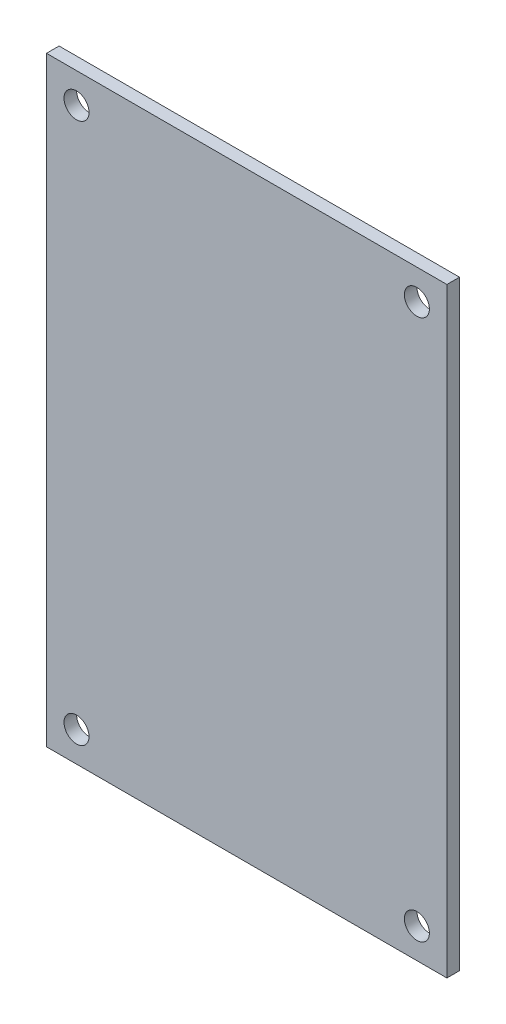
ISO-10303-21;
HEADER;
FILE_DESCRIPTION(('STEP AP214'),'2;1');
FILE_NAME('part.step','',(''),(''),'','','');
FILE_SCHEMA(('AUTOMOTIVE_DESIGN { 1 0 10303 214 1 1 1 1 }'));
ENDSEC;
DATA;
#1=APPLICATION_CONTEXT('core data for automotive mechanical design processes');
#2=APPLICATION_PROTOCOL_DEFINITION('international standard','automotive_design',2000,#1);
#3=PRODUCT_CONTEXT('',#1,'mechanical');
#4=PRODUCT('Part','Part','',(#3));
#5=PRODUCT_RELATED_PRODUCT_CATEGORY('part','',(#4));
#6=PRODUCT_DEFINITION_FORMATION('','',#4);
#7=PRODUCT_DEFINITION_CONTEXT('part definition',#1,'design');
#8=PRODUCT_DEFINITION('design','',#6,#7);
#9=PRODUCT_DEFINITION_SHAPE('','',#8);
#10=(LENGTH_UNIT() NAMED_UNIT(*) SI_UNIT(.MILLI.,.METRE.));
#11=(NAMED_UNIT(*) PLANE_ANGLE_UNIT() SI_UNIT($,.RADIAN.));
#12=(NAMED_UNIT(*) SI_UNIT($,.STERADIAN.) SOLID_ANGLE_UNIT());
#13=UNCERTAINTY_MEASURE_WITH_UNIT(LENGTH_MEASURE(1.E-05),#10,'distance_accuracy_value','');
#14=(GEOMETRIC_REPRESENTATION_CONTEXT(3) GLOBAL_UNCERTAINTY_ASSIGNED_CONTEXT((#13)) GLOBAL_UNIT_ASSIGNED_CONTEXT((#10,
#11,#12)) REPRESENTATION_CONTEXT('',''));
#15=CARTESIAN_POINT('',(0.,0.,0.));
#16=DIRECTION('',(0.,0.,1.));
#17=DIRECTION('',(1.,0.,0.));
#18=AXIS2_PLACEMENT_3D('',#15,#16,#17);
#19=CARTESIAN_POINT('',(-25.4,-38.1,1.6002));
#20=DIRECTION('',(1.,0.,0.));
#21=DIRECTION('',(0.,0.,-1.));
#22=AXIS2_PLACEMENT_3D('',#19,#20,#21);
#23=PLANE('',#22);
#24=DIRECTION('',(0.,-1.,0.));
#25=VECTOR('',#24,1.);
#26=CARTESIAN_POINT('',(-25.4,-38.1,0.));
#27=LINE('',#26,#25);
#28=CARTESIAN_POINT('',(-25.4,38.1,0.));
#29=VERTEX_POINT('',#28);
#30=CARTESIAN_POINT('',(-25.4,-38.1,0.));
#31=VERTEX_POINT('',#30);
#32=EDGE_CURVE('E107',#29,#31,#27,.T.);
#33=ORIENTED_EDGE('',*,*,#32,.T.);
#34=DIRECTION('',(0.,0.,-1.));
#35=VECTOR('',#34,1.);
#36=CARTESIAN_POINT('',(-25.4,-38.1,1.6002));
#37=LINE('',#36,#35);
#38=CARTESIAN_POINT('',(-25.4,-38.1,1.6002));
#39=VERTEX_POINT('',#38);
#40=EDGE_CURVE('E11',#39,#31,#37,.T.);
#41=ORIENTED_EDGE('',*,*,#40,.F.);
#42=DIRECTION('',(0.,-1.,0.));
#43=VECTOR('',#42,1.);
#44=CARTESIAN_POINT('',(-25.4,-38.1,1.6002));
#45=LINE('',#44,#43);
#46=CARTESIAN_POINT('',(-25.4,38.1,1.6002));
#47=VERTEX_POINT('',#46);
#48=EDGE_CURVE('E91',#47,#39,#45,.T.);
#49=ORIENTED_EDGE('',*,*,#48,.F.);
#50=DIRECTION('',(0.,0.,-1.));
#51=VECTOR('',#50,1.);
#52=CARTESIAN_POINT('',(-25.4,38.1,1.6002));
#53=LINE('',#52,#51);
#54=EDGE_CURVE('E103',#47,#29,#53,.T.);
#55=ORIENTED_EDGE('',*,*,#54,.T.);
#56=EDGE_LOOP('',(#33,#41,#49,#55));
#57=FACE_BOUND('',#56,.T.);
#58=ADVANCED_FACE('F39',(#57),#23,.F.);
#59=CARTESIAN_POINT('',(25.4,-38.1,1.6002));
#60=DIRECTION('',(0.,1.,0.));
#61=DIRECTION('',(-1.,0.,0.));
#62=AXIS2_PLACEMENT_3D('',#59,#60,#61);
#63=PLANE('',#62);
#64=DIRECTION('',(1.,0.,0.));
#65=VECTOR('',#64,1.);
#66=CARTESIAN_POINT('',(25.4,-38.1,0.));
#67=LINE('',#66,#65);
#68=CARTESIAN_POINT('',(25.4,-38.1,0.));
#69=VERTEX_POINT('',#68);
#70=EDGE_CURVE('E96',#31,#69,#67,.T.);
#71=ORIENTED_EDGE('',*,*,#70,.T.);
#72=DIRECTION('',(0.,0.,-1.));
#73=VECTOR('',#72,1.);
#74=CARTESIAN_POINT('',(25.4,-38.1,1.6002));
#75=LINE('',#74,#73);
#76=CARTESIAN_POINT('',(25.4,-38.1,1.6002));
#77=VERTEX_POINT('',#76);
#78=EDGE_CURVE('E48',#77,#69,#75,.T.);
#79=ORIENTED_EDGE('',*,*,#78,.F.);
#80=DIRECTION('',(1.,0.,0.));
#81=VECTOR('',#80,1.);
#82=CARTESIAN_POINT('',(25.4,-38.1,1.6002));
#83=LINE('',#82,#81);
#84=EDGE_CURVE('E86',#39,#77,#83,.T.);
#85=ORIENTED_EDGE('',*,*,#84,.F.);
#86=ORIENTED_EDGE('',*,*,#40,.T.);
#87=EDGE_LOOP('',(#71,#79,#85,#86));
#88=FACE_BOUND('',#87,.T.);
#89=ADVANCED_FACE('F95',(#88),#63,.F.);
#90=CARTESIAN_POINT('',(25.4,-38.1,1.6002));
#91=DIRECTION('',(-1.,0.,0.));
#92=DIRECTION('',(0.,0.,1.));
#93=AXIS2_PLACEMENT_3D('',#90,#91,#92);
#94=PLANE('',#93);
#95=DIRECTION('',(0.,1.,0.));
#96=VECTOR('',#95,1.);
#97=CARTESIAN_POINT('',(25.4,-38.1,0.));
#98=LINE('',#97,#96);
#99=CARTESIAN_POINT('',(25.4,38.1,0.));
#100=VERTEX_POINT('',#99);
#101=EDGE_CURVE('E73',#69,#100,#98,.T.);
#102=ORIENTED_EDGE('',*,*,#101,.T.);
#103=DIRECTION('',(0.,0.,-1.));
#104=VECTOR('',#103,1.);
#105=CARTESIAN_POINT('',(25.4,38.1,1.6002));
#106=LINE('',#105,#104);
#107=CARTESIAN_POINT('',(25.4,38.1,1.6002));
#108=VERTEX_POINT('',#107);
#109=EDGE_CURVE('E98',#108,#100,#106,.T.);
#110=ORIENTED_EDGE('',*,*,#109,.F.);
#111=DIRECTION('',(0.,1.,0.));
#112=VECTOR('',#111,1.);
#113=CARTESIAN_POINT('',(25.4,-38.1,1.6002));
#114=LINE('',#113,#112);
#115=EDGE_CURVE('E89',#77,#108,#114,.T.);
#116=ORIENTED_EDGE('',*,*,#115,.F.);
#117=ORIENTED_EDGE('',*,*,#78,.T.);
#118=EDGE_LOOP('',(#102,#110,#116,#117));
#119=FACE_BOUND('',#118,.T.);
#120=ADVANCED_FACE('F99',(#119),#94,.F.);
#121=CARTESIAN_POINT('',(25.4,38.1,1.6002));
#122=DIRECTION('',(0.,-1.,0.));
#123=DIRECTION('',(1.,0.,0.));
#124=AXIS2_PLACEMENT_3D('',#121,#122,#123);
#125=PLANE('',#124);
#126=DIRECTION('',(-1.,0.,0.));
#127=VECTOR('',#126,1.);
#128=CARTESIAN_POINT('',(25.4,38.1,0.));
#129=LINE('',#128,#127);
#130=EDGE_CURVE('E79',#100,#29,#129,.T.);
#131=ORIENTED_EDGE('',*,*,#130,.T.);
#132=ORIENTED_EDGE('',*,*,#54,.F.);
#133=DIRECTION('',(-1.,0.,0.));
#134=VECTOR('',#133,1.);
#135=CARTESIAN_POINT('',(25.4,38.1,1.6002));
#136=LINE('',#135,#134);
#137=EDGE_CURVE('E56',#108,#47,#136,.T.);
#138=ORIENTED_EDGE('',*,*,#137,.F.);
#139=ORIENTED_EDGE('',*,*,#109,.T.);
#140=EDGE_LOOP('',(#131,#132,#138,#139));
#141=FACE_BOUND('',#140,.T.);
#142=ADVANCED_FACE('F121',(#141),#125,.F.);
#143=CARTESIAN_POINT('',(0.,0.,1.6002));
#144=DIRECTION('',(0.,0.,1.));
#145=DIRECTION('',(1.,0.,0.));
#146=AXIS2_PLACEMENT_3D('',#143,#144,#145);
#147=PLANE('',#146);
#148=CARTESIAN_POINT('',(-21.59,-34.29,1.6002));
#149=DIRECTION('',(0.,0.,1.));
#150=DIRECTION('',(-1.,0.,0.));
#151=AXIS2_PLACEMENT_3D('',#148,#149,#150);
#152=CIRCLE('',#151,1.5875);
#153=CARTESIAN_POINT('',(-20.0025,-34.29,1.6002));
#154=VERTEX_POINT('',#153);
#155=EDGE_CURVE('E141',#154,#154,#152,.T.);
#156=ORIENTED_EDGE('',*,*,#155,.F.);
#157=EDGE_LOOP('',(#156));
#158=FACE_BOUND('',#157,.T.);
#159=CARTESIAN_POINT('',(21.59,-34.29,1.6002));
#160=DIRECTION('',(0.,0.,1.));
#161=DIRECTION('',(1.,0.,0.));
#162=AXIS2_PLACEMENT_3D('',#159,#160,#161);
#163=CIRCLE('',#162,1.5875);
#164=CARTESIAN_POINT('',(23.1775,-34.29,1.6002));
#165=VERTEX_POINT('',#164);
#166=EDGE_CURVE('E140',#165,#165,#163,.T.);
#167=ORIENTED_EDGE('',*,*,#166,.F.);
#168=EDGE_LOOP('',(#167));
#169=FACE_BOUND('',#168,.T.);
#170=CARTESIAN_POINT('',(21.59,34.29,1.6002));
#171=DIRECTION('',(0.,0.,1.));
#172=DIRECTION('',(-1.,0.,0.));
#173=AXIS2_PLACEMENT_3D('',#170,#171,#172);
#174=CIRCLE('',#173,1.5875);
#175=CARTESIAN_POINT('',(23.1775,34.29,1.6002));
#176=VERTEX_POINT('',#175);
#177=EDGE_CURVE('E149',#176,#176,#174,.T.);
#178=ORIENTED_EDGE('',*,*,#177,.F.);
#179=EDGE_LOOP('',(#178));
#180=FACE_BOUND('',#179,.T.);
#181=CARTESIAN_POINT('',(-21.59,34.29,1.6002));
#182=DIRECTION('',(0.,0.,1.));
#183=DIRECTION('',(1.,0.,0.));
#184=AXIS2_PLACEMENT_3D('',#181,#182,#183);
#185=CIRCLE('',#184,1.5875);
#186=CARTESIAN_POINT('',(-20.0025,34.29,1.6002));
#187=VERTEX_POINT('',#186);
#188=EDGE_CURVE('E131',#187,#187,#185,.T.);
#189=ORIENTED_EDGE('',*,*,#188,.F.);
#190=EDGE_LOOP('',(#189));
#191=FACE_BOUND('',#190,.T.);
#192=ORIENTED_EDGE('',*,*,#48,.T.);
#193=ORIENTED_EDGE('',*,*,#84,.T.);
#194=ORIENTED_EDGE('',*,*,#115,.T.);
#195=ORIENTED_EDGE('',*,*,#137,.T.);
#196=EDGE_LOOP('',(#192,#193,#194,#195));
#197=FACE_BOUND('',#196,.T.);
#198=ADVANCED_FACE('F87',(#158,#169,#180,#191,#197),#147,.T.);
#199=CARTESIAN_POINT('',(0.,0.,0.));
#200=DIRECTION('',(0.,0.,1.));
#201=DIRECTION('',(1.,0.,0.));
#202=AXIS2_PLACEMENT_3D('',#199,#200,#201);
#203=PLANE('',#202);
#204=CARTESIAN_POINT('',(-21.59,-34.29,0.));
#205=DIRECTION('',(0.,0.,1.));
#206=DIRECTION('',(1.,0.,0.));
#207=AXIS2_PLACEMENT_3D('',#204,#205,#206);
#208=CIRCLE('',#207,1.5875);
#209=CARTESIAN_POINT('',(-20.0025,-34.29,0.));
#210=VERTEX_POINT('',#209);
#211=EDGE_CURVE('E136',#210,#210,#208,.F.);
#212=ORIENTED_EDGE('',*,*,#211,.F.);
#213=EDGE_LOOP('',(#212));
#214=FACE_BOUND('',#213,.T.);
#215=CARTESIAN_POINT('',(21.59,-34.29,0.));
#216=DIRECTION('',(0.,0.,1.));
#217=DIRECTION('',(1.,0.,0.));
#218=AXIS2_PLACEMENT_3D('',#215,#216,#217);
#219=CIRCLE('',#218,1.5875);
#220=CARTESIAN_POINT('',(23.1775,-34.29,0.));
#221=VERTEX_POINT('',#220);
#222=EDGE_CURVE('E145',#221,#221,#219,.F.);
#223=ORIENTED_EDGE('',*,*,#222,.F.);
#224=EDGE_LOOP('',(#223));
#225=FACE_BOUND('',#224,.T.);
#226=CARTESIAN_POINT('',(21.59,34.29,0.));
#227=DIRECTION('',(0.,0.,1.));
#228=DIRECTION('',(1.,0.,0.));
#229=AXIS2_PLACEMENT_3D('',#226,#227,#228);
#230=CIRCLE('',#229,1.5875);
#231=CARTESIAN_POINT('',(23.1775,34.29,0.));
#232=VERTEX_POINT('',#231);
#233=EDGE_CURVE('E135',#232,#232,#230,.F.);
#234=ORIENTED_EDGE('',*,*,#233,.F.);
#235=EDGE_LOOP('',(#234));
#236=FACE_BOUND('',#235,.T.);
#237=CARTESIAN_POINT('',(-21.59,34.29,0.));
#238=DIRECTION('',(0.,0.,1.));
#239=DIRECTION('',(1.,0.,0.));
#240=AXIS2_PLACEMENT_3D('',#237,#238,#239);
#241=CIRCLE('',#240,1.5875);
#242=CARTESIAN_POINT('',(-20.0025,34.29,0.));
#243=VERTEX_POINT('',#242);
#244=EDGE_CURVE('E111',#243,#243,#241,.F.);
#245=ORIENTED_EDGE('',*,*,#244,.F.);
#246=EDGE_LOOP('',(#245));
#247=FACE_BOUND('',#246,.T.);
#248=ORIENTED_EDGE('',*,*,#32,.F.);
#249=ORIENTED_EDGE('',*,*,#130,.F.);
#250=ORIENTED_EDGE('',*,*,#101,.F.);
#251=ORIENTED_EDGE('',*,*,#70,.F.);
#252=EDGE_LOOP('',(#248,#249,#250,#251));
#253=FACE_BOUND('',#252,.T.);
#254=ADVANCED_FACE('F124',(#214,#225,#236,#247,#253),#203,.F.);
#255=CARTESIAN_POINT('',(-21.59,34.29,-0.000999999999999916));
#256=DIRECTION('',(0.,0.,1.));
#257=DIRECTION('',(1.,0.,0.));
#258=AXIS2_PLACEMENT_3D('',#255,#256,#257);
#259=CYLINDRICAL_SURFACE('',#258,1.5875);
#260=CARTESIAN_POINT('',(-20.0025,34.29,1.6002));
#261=CARTESIAN_POINT('',(-20.0025,34.29,1.58353125));
#262=CARTESIAN_POINT('',(-20.0025,34.29,1.5668625));
#263=CARTESIAN_POINT('',(-20.0025,34.29,1.533525));
#264=CARTESIAN_POINT('',(-20.0025,34.29,1.51685625));
#265=CARTESIAN_POINT('',(-20.0025,34.29,1.48351875));
#266=CARTESIAN_POINT('',(-20.0025,34.29,1.46685));
#267=CARTESIAN_POINT('',(-20.0025,34.29,1.4335125));
#268=CARTESIAN_POINT('',(-20.0025,34.29,1.41684375));
#269=CARTESIAN_POINT('',(-20.0025,34.29,1.38350625));
#270=CARTESIAN_POINT('',(-20.0025,34.29,1.3668375));
#271=CARTESIAN_POINT('',(-20.0025,34.29,1.3335));
#272=CARTESIAN_POINT('',(-20.0025,34.29,1.31683125));
#273=CARTESIAN_POINT('',(-20.0025,34.29,1.28349375));
#274=CARTESIAN_POINT('',(-20.0025,34.29,1.266825));
#275=CARTESIAN_POINT('',(-20.0025,34.29,1.2334875));
#276=CARTESIAN_POINT('',(-20.0025,34.29,1.21681875));
#277=CARTESIAN_POINT('',(-20.0025,34.29,1.18348125));
#278=CARTESIAN_POINT('',(-20.0025,34.29,1.1668125));
#279=CARTESIAN_POINT('',(-20.0025,34.29,1.133475));
#280=CARTESIAN_POINT('',(-20.0025,34.29,1.11680625));
#281=CARTESIAN_POINT('',(-20.0025,34.29,1.08346875));
#282=CARTESIAN_POINT('',(-20.0025,34.29,1.0668));
#283=CARTESIAN_POINT('',(-20.0025,34.29,1.0334625));
#284=CARTESIAN_POINT('',(-20.0025,34.29,1.01679375));
#285=CARTESIAN_POINT('',(-20.0025,34.29,0.98345625));
#286=CARTESIAN_POINT('',(-20.0025,34.29,0.9667875));
#287=CARTESIAN_POINT('',(-20.0025,34.29,0.93345));
#288=CARTESIAN_POINT('',(-20.0025,34.29,0.91678125));
#289=CARTESIAN_POINT('',(-20.0025,34.29,0.88344375));
#290=CARTESIAN_POINT('',(-20.0025,34.29,0.866775));
#291=CARTESIAN_POINT('',(-20.0025,34.29,0.8334375));
#292=CARTESIAN_POINT('',(-20.0025,34.29,0.81676875));
#293=CARTESIAN_POINT('',(-20.0025,34.29,0.78343125));
#294=CARTESIAN_POINT('',(-20.0025,34.29,0.7667625));
#295=CARTESIAN_POINT('',(-20.0025,34.29,0.733425));
#296=CARTESIAN_POINT('',(-20.0025,34.29,0.71675625));
#297=CARTESIAN_POINT('',(-20.0025,34.29,0.68341875));
#298=CARTESIAN_POINT('',(-20.0025,34.29,0.66675));
#299=CARTESIAN_POINT('',(-20.0025,34.29,0.6334125));
#300=CARTESIAN_POINT('',(-20.0025,34.29,0.61674375));
#301=CARTESIAN_POINT('',(-20.0025,34.29,0.58340625));
#302=CARTESIAN_POINT('',(-20.0025,34.29,0.5667375));
#303=CARTESIAN_POINT('',(-20.0025,34.29,0.5334));
#304=CARTESIAN_POINT('',(-20.0025,34.29,0.51673125));
#305=CARTESIAN_POINT('',(-20.0025,34.29,0.48339375));
#306=CARTESIAN_POINT('',(-20.0025,34.29,0.466725));
#307=CARTESIAN_POINT('',(-20.0025,34.29,0.4333875));
#308=CARTESIAN_POINT('',(-20.0025,34.29,0.41671875));
#309=CARTESIAN_POINT('',(-20.0025,34.29,0.38338125));
#310=CARTESIAN_POINT('',(-20.0025,34.29,0.3667125));
#311=CARTESIAN_POINT('',(-20.0025,34.29,0.333375));
#312=CARTESIAN_POINT('',(-20.0025,34.29,0.31670625));
#313=CARTESIAN_POINT('',(-20.0025,34.29,0.28336875));
#314=CARTESIAN_POINT('',(-20.0025,34.29,0.2667));
#315=CARTESIAN_POINT('',(-20.0025,34.29,0.2333625));
#316=CARTESIAN_POINT('',(-20.0025,34.29,0.21669375));
#317=CARTESIAN_POINT('',(-20.0025,34.29,0.18335625));
#318=CARTESIAN_POINT('',(-20.0025,34.29,0.1666875));
#319=CARTESIAN_POINT('',(-20.0025,34.29,0.13335));
#320=CARTESIAN_POINT('',(-20.0025,34.29,0.11668125));
#321=CARTESIAN_POINT('',(-20.0025,34.29,0.08334375));
#322=CARTESIAN_POINT('',(-20.0025,34.29,0.066675));
#323=CARTESIAN_POINT('',(-20.0025,34.29,0.0333375000000001));
#324=CARTESIAN_POINT('',(-20.0025,34.29,0.01666875));
#325=CARTESIAN_POINT('',(-20.0025,34.29,0.));
#326=B_SPLINE_CURVE_WITH_KNOTS('',3,(#260,#261,#262,#263,#264,#265,#266,#267,#268,#269,#270,
#271,#272,#273,#274,#275,#276,#277,#278,#279,#280,#281,#282,#283,#284,#285,#286,#287,#288,#289,
#290,#291,#292,#293,#294,#295,#296,#297,#298,#299,#300,#301,#302,#303,#304,#305,#306,#307,#308,
#309,#310,#311,#312,#313,#314,#315,#316,#317,#318,#319,#320,#321,#322,#323,#324,#325),
.UNSPECIFIED.,.F.,.F.,(4,2,2,2,2,2,2,2,2,2,2,2,2,2,2,2,2,2,2,2,2,2,2,2,2,2,2,2,2,2,2,2,4),(0.,
0.0500062500000001,0.1000125,0.15001875,0.200025,0.25003125,0.3000375,0.35004375,0.40005,
0.45005625,0.5000625,0.55006875,0.600075,0.65008125,0.7000875,0.75009375,0.8001,0.85010625,
0.9001125,0.95011875,1.000125,1.05013125,1.1001375,1.15014375,1.20015,1.25015625,1.3001625,
1.35016875,1.400175,1.45018125,1.5001875,1.55019375,1.6002),.UNSPECIFIED.);
#327=EDGE_CURVE('BSEAM169',#187,#243,#326,.T.);
#328=ORIENTED_EDGE('',*,*,#188,.T.);
#329=ORIENTED_EDGE('',*,*,#244,.T.);
#330=ORIENTED_EDGE('',*,*,#327,.T.);
#331=ORIENTED_EDGE('',*,*,#327,.F.);
#332=EDGE_LOOP('',(#328,#330,#329,#331));
#333=FACE_BOUND('',#332,.T.);
#334=ADVANCED_FACE('F169',(#333),#259,.F.);
#335=CARTESIAN_POINT('',(21.59,34.29,-0.000999999999999916));
#336=DIRECTION('',(0.,0.,1.));
#337=DIRECTION('',(1.,0.,0.));
#338=AXIS2_PLACEMENT_3D('',#335,#336,#337);
#339=CYLINDRICAL_SURFACE('',#338,1.5875);
#340=CARTESIAN_POINT('',(23.1775,34.29,1.6002));
#341=CARTESIAN_POINT('',(23.1775,34.29,1.58353125));
#342=CARTESIAN_POINT('',(23.1775,34.29,1.5668625));
#343=CARTESIAN_POINT('',(23.1775,34.29,1.533525));
#344=CARTESIAN_POINT('',(23.1775,34.29,1.51685625));
#345=CARTESIAN_POINT('',(23.1775,34.29,1.48351875));
#346=CARTESIAN_POINT('',(23.1775,34.29,1.46685));
#347=CARTESIAN_POINT('',(23.1775,34.29,1.4335125));
#348=CARTESIAN_POINT('',(23.1775,34.29,1.41684375));
#349=CARTESIAN_POINT('',(23.1775,34.29,1.38350625));
#350=CARTESIAN_POINT('',(23.1775,34.29,1.3668375));
#351=CARTESIAN_POINT('',(23.1775,34.29,1.3335));
#352=CARTESIAN_POINT('',(23.1775,34.29,1.31683125));
#353=CARTESIAN_POINT('',(23.1775,34.29,1.28349375));
#354=CARTESIAN_POINT('',(23.1775,34.29,1.266825));
#355=CARTESIAN_POINT('',(23.1775,34.29,1.2334875));
#356=CARTESIAN_POINT('',(23.1775,34.29,1.21681875));
#357=CARTESIAN_POINT('',(23.1775,34.29,1.18348125));
#358=CARTESIAN_POINT('',(23.1775,34.29,1.1668125));
#359=CARTESIAN_POINT('',(23.1775,34.29,1.133475));
#360=CARTESIAN_POINT('',(23.1775,34.29,1.11680625));
#361=CARTESIAN_POINT('',(23.1775,34.29,1.08346875));
#362=CARTESIAN_POINT('',(23.1775,34.29,1.0668));
#363=CARTESIAN_POINT('',(23.1775,34.29,1.0334625));
#364=CARTESIAN_POINT('',(23.1775,34.29,1.01679375));
#365=CARTESIAN_POINT('',(23.1775,34.29,0.98345625));
#366=CARTESIAN_POINT('',(23.1775,34.29,0.9667875));
#367=CARTESIAN_POINT('',(23.1775,34.29,0.93345));
#368=CARTESIAN_POINT('',(23.1775,34.29,0.91678125));
#369=CARTESIAN_POINT('',(23.1775,34.29,0.88344375));
#370=CARTESIAN_POINT('',(23.1775,34.29,0.866775));
#371=CARTESIAN_POINT('',(23.1775,34.29,0.8334375));
#372=CARTESIAN_POINT('',(23.1775,34.29,0.81676875));
#373=CARTESIAN_POINT('',(23.1775,34.29,0.78343125));
#374=CARTESIAN_POINT('',(23.1775,34.29,0.7667625));
#375=CARTESIAN_POINT('',(23.1775,34.29,0.733425));
#376=CARTESIAN_POINT('',(23.1775,34.29,0.71675625));
#377=CARTESIAN_POINT('',(23.1775,34.29,0.68341875));
#378=CARTESIAN_POINT('',(23.1775,34.29,0.66675));
#379=CARTESIAN_POINT('',(23.1775,34.29,0.6334125));
#380=CARTESIAN_POINT('',(23.1775,34.29,0.61674375));
#381=CARTESIAN_POINT('',(23.1775,34.29,0.58340625));
#382=CARTESIAN_POINT('',(23.1775,34.29,0.5667375));
#383=CARTESIAN_POINT('',(23.1775,34.29,0.5334));
#384=CARTESIAN_POINT('',(23.1775,34.29,0.51673125));
#385=CARTESIAN_POINT('',(23.1775,34.29,0.48339375));
#386=CARTESIAN_POINT('',(23.1775,34.29,0.466725));
#387=CARTESIAN_POINT('',(23.1775,34.29,0.4333875));
#388=CARTESIAN_POINT('',(23.1775,34.29,0.41671875));
#389=CARTESIAN_POINT('',(23.1775,34.29,0.38338125));
#390=CARTESIAN_POINT('',(23.1775,34.29,0.3667125));
#391=CARTESIAN_POINT('',(23.1775,34.29,0.333375));
#392=CARTESIAN_POINT('',(23.1775,34.29,0.31670625));
#393=CARTESIAN_POINT('',(23.1775,34.29,0.28336875));
#394=CARTESIAN_POINT('',(23.1775,34.29,0.2667));
#395=CARTESIAN_POINT('',(23.1775,34.29,0.2333625));
#396=CARTESIAN_POINT('',(23.1775,34.29,0.21669375));
#397=CARTESIAN_POINT('',(23.1775,34.29,0.18335625));
#398=CARTESIAN_POINT('',(23.1775,34.29,0.1666875));
#399=CARTESIAN_POINT('',(23.1775,34.29,0.13335));
#400=CARTESIAN_POINT('',(23.1775,34.29,0.11668125));
#401=CARTESIAN_POINT('',(23.1775,34.29,0.08334375));
#402=CARTESIAN_POINT('',(23.1775,34.29,0.066675));
#403=CARTESIAN_POINT('',(23.1775,34.29,0.0333375000000001));
#404=CARTESIAN_POINT('',(23.1775,34.29,0.01666875));
#405=CARTESIAN_POINT('',(23.1775,34.29,0.));
#406=B_SPLINE_CURVE_WITH_KNOTS('',3,(#340,#341,#342,#343,#344,#345,#346,#347,#348,#349,#350,
#351,#352,#353,#354,#355,#356,#357,#358,#359,#360,#361,#362,#363,#364,#365,#366,#367,#368,#369,
#370,#371,#372,#373,#374,#375,#376,#377,#378,#379,#380,#381,#382,#383,#384,#385,#386,#387,#388,
#389,#390,#391,#392,#393,#394,#395,#396,#397,#398,#399,#400,#401,#402,#403,#404,#405),
.UNSPECIFIED.,.F.,.F.,(4,2,2,2,2,2,2,2,2,2,2,2,2,2,2,2,2,2,2,2,2,2,2,2,2,2,2,2,2,2,2,2,4),(0.,
0.0500062500000001,0.1000125,0.15001875,0.200025,0.25003125,0.3000375,0.35004375,0.40005,
0.45005625,0.5000625,0.55006875,0.600075,0.65008125,0.7000875,0.75009375,0.8001,0.85010625,
0.9001125,0.95011875,1.000125,1.05013125,1.1001375,1.15014375,1.20015,1.25015625,1.3001625,
1.35016875,1.400175,1.45018125,1.5001875,1.55019375,1.6002),.UNSPECIFIED.);
#407=EDGE_CURVE('BSEAM160',#176,#232,#406,.T.);
#408=ORIENTED_EDGE('',*,*,#177,.T.);
#409=ORIENTED_EDGE('',*,*,#233,.T.);
#410=ORIENTED_EDGE('',*,*,#407,.T.);
#411=ORIENTED_EDGE('',*,*,#407,.F.);
#412=EDGE_LOOP('',(#408,#410,#409,#411));
#413=FACE_BOUND('',#412,.T.);
#414=ADVANCED_FACE('F160',(#413),#339,.F.);
#415=CARTESIAN_POINT('',(21.59,-34.29,-0.000999999999999916));
#416=DIRECTION('',(0.,0.,1.));
#417=DIRECTION('',(1.,0.,0.));
#418=AXIS2_PLACEMENT_3D('',#415,#416,#417);
#419=CYLINDRICAL_SURFACE('',#418,1.5875);
#420=CARTESIAN_POINT('',(23.1775,-34.29,1.6002));
#421=CARTESIAN_POINT('',(23.1775,-34.29,1.58353125));
#422=CARTESIAN_POINT('',(23.1775,-34.29,1.5668625));
#423=CARTESIAN_POINT('',(23.1775,-34.29,1.533525));
#424=CARTESIAN_POINT('',(23.1775,-34.29,1.51685625));
#425=CARTESIAN_POINT('',(23.1775,-34.29,1.48351875));
#426=CARTESIAN_POINT('',(23.1775,-34.29,1.46685));
#427=CARTESIAN_POINT('',(23.1775,-34.29,1.4335125));
#428=CARTESIAN_POINT('',(23.1775,-34.29,1.41684375));
#429=CARTESIAN_POINT('',(23.1775,-34.29,1.38350625));
#430=CARTESIAN_POINT('',(23.1775,-34.29,1.3668375));
#431=CARTESIAN_POINT('',(23.1775,-34.29,1.3335));
#432=CARTESIAN_POINT('',(23.1775,-34.29,1.31683125));
#433=CARTESIAN_POINT('',(23.1775,-34.29,1.28349375));
#434=CARTESIAN_POINT('',(23.1775,-34.29,1.266825));
#435=CARTESIAN_POINT('',(23.1775,-34.29,1.2334875));
#436=CARTESIAN_POINT('',(23.1775,-34.29,1.21681875));
#437=CARTESIAN_POINT('',(23.1775,-34.29,1.18348125));
#438=CARTESIAN_POINT('',(23.1775,-34.29,1.1668125));
#439=CARTESIAN_POINT('',(23.1775,-34.29,1.133475));
#440=CARTESIAN_POINT('',(23.1775,-34.29,1.11680625));
#441=CARTESIAN_POINT('',(23.1775,-34.29,1.08346875));
#442=CARTESIAN_POINT('',(23.1775,-34.29,1.0668));
#443=CARTESIAN_POINT('',(23.1775,-34.29,1.0334625));
#444=CARTESIAN_POINT('',(23.1775,-34.29,1.01679375));
#445=CARTESIAN_POINT('',(23.1775,-34.29,0.98345625));
#446=CARTESIAN_POINT('',(23.1775,-34.29,0.9667875));
#447=CARTESIAN_POINT('',(23.1775,-34.29,0.93345));
#448=CARTESIAN_POINT('',(23.1775,-34.29,0.91678125));
#449=CARTESIAN_POINT('',(23.1775,-34.29,0.88344375));
#450=CARTESIAN_POINT('',(23.1775,-34.29,0.866775));
#451=CARTESIAN_POINT('',(23.1775,-34.29,0.8334375));
#452=CARTESIAN_POINT('',(23.1775,-34.29,0.81676875));
#453=CARTESIAN_POINT('',(23.1775,-34.29,0.78343125));
#454=CARTESIAN_POINT('',(23.1775,-34.29,0.7667625));
#455=CARTESIAN_POINT('',(23.1775,-34.29,0.733425));
#456=CARTESIAN_POINT('',(23.1775,-34.29,0.71675625));
#457=CARTESIAN_POINT('',(23.1775,-34.29,0.68341875));
#458=CARTESIAN_POINT('',(23.1775,-34.29,0.66675));
#459=CARTESIAN_POINT('',(23.1775,-34.29,0.6334125));
#460=CARTESIAN_POINT('',(23.1775,-34.29,0.61674375));
#461=CARTESIAN_POINT('',(23.1775,-34.29,0.58340625));
#462=CARTESIAN_POINT('',(23.1775,-34.29,0.5667375));
#463=CARTESIAN_POINT('',(23.1775,-34.29,0.5334));
#464=CARTESIAN_POINT('',(23.1775,-34.29,0.51673125));
#465=CARTESIAN_POINT('',(23.1775,-34.29,0.48339375));
#466=CARTESIAN_POINT('',(23.1775,-34.29,0.466725));
#467=CARTESIAN_POINT('',(23.1775,-34.29,0.4333875));
#468=CARTESIAN_POINT('',(23.1775,-34.29,0.41671875));
#469=CARTESIAN_POINT('',(23.1775,-34.29,0.38338125));
#470=CARTESIAN_POINT('',(23.1775,-34.29,0.3667125));
#471=CARTESIAN_POINT('',(23.1775,-34.29,0.333375));
#472=CARTESIAN_POINT('',(23.1775,-34.29,0.31670625));
#473=CARTESIAN_POINT('',(23.1775,-34.29,0.28336875));
#474=CARTESIAN_POINT('',(23.1775,-34.29,0.2667));
#475=CARTESIAN_POINT('',(23.1775,-34.29,0.2333625));
#476=CARTESIAN_POINT('',(23.1775,-34.29,0.21669375));
#477=CARTESIAN_POINT('',(23.1775,-34.29,0.18335625));
#478=CARTESIAN_POINT('',(23.1775,-34.29,0.1666875));
#479=CARTESIAN_POINT('',(23.1775,-34.29,0.13335));
#480=CARTESIAN_POINT('',(23.1775,-34.29,0.11668125));
#481=CARTESIAN_POINT('',(23.1775,-34.29,0.08334375));
#482=CARTESIAN_POINT('',(23.1775,-34.29,0.066675));
#483=CARTESIAN_POINT('',(23.1775,-34.29,0.0333375000000001));
#484=CARTESIAN_POINT('',(23.1775,-34.29,0.01666875));
#485=CARTESIAN_POINT('',(23.1775,-34.29,0.));
#486=B_SPLINE_CURVE_WITH_KNOTS('',3,(#420,#421,#422,#423,#424,#425,#426,#427,#428,#429,#430,
#431,#432,#433,#434,#435,#436,#437,#438,#439,#440,#441,#442,#443,#444,#445,#446,#447,#448,#449,
#450,#451,#452,#453,#454,#455,#456,#457,#458,#459,#460,#461,#462,#463,#464,#465,#466,#467,#468,
#469,#470,#471,#472,#473,#474,#475,#476,#477,#478,#479,#480,#481,#482,#483,#484,#485),
.UNSPECIFIED.,.F.,.F.,(4,2,2,2,2,2,2,2,2,2,2,2,2,2,2,2,2,2,2,2,2,2,2,2,2,2,2,2,2,2,2,2,4),(0.,
0.0500062500000001,0.1000125,0.15001875,0.200025,0.25003125,0.3000375,0.35004375,0.40005,
0.45005625,0.5000625,0.55006875,0.600075,0.65008125,0.7000875,0.75009375,0.8001,0.85010625,
0.9001125,0.95011875,1.000125,1.05013125,1.1001375,1.15014375,1.20015,1.25015625,1.3001625,
1.35016875,1.400175,1.45018125,1.5001875,1.55019375,1.6002),.UNSPECIFIED.);
#487=EDGE_CURVE('BSEAM219',#165,#221,#486,.T.);
#488=ORIENTED_EDGE('',*,*,#166,.T.);
#489=ORIENTED_EDGE('',*,*,#222,.T.);
#490=ORIENTED_EDGE('',*,*,#487,.T.);
#491=ORIENTED_EDGE('',*,*,#487,.F.);
#492=EDGE_LOOP('',(#488,#490,#489,#491));
#493=FACE_BOUND('',#492,.T.);
#494=ADVANCED_FACE('F219',(#493),#419,.F.);
#495=CARTESIAN_POINT('',(-21.59,-34.29,-0.000999999999999916));
#496=DIRECTION('',(0.,0.,1.));
#497=DIRECTION('',(1.,0.,0.));
#498=AXIS2_PLACEMENT_3D('',#495,#496,#497);
#499=CYLINDRICAL_SURFACE('',#498,1.5875);
#500=CARTESIAN_POINT('',(-20.0025,-34.29,1.6002));
#501=CARTESIAN_POINT('',(-20.0025,-34.29,1.58353125));
#502=CARTESIAN_POINT('',(-20.0025,-34.29,1.5668625));
#503=CARTESIAN_POINT('',(-20.0025,-34.29,1.533525));
#504=CARTESIAN_POINT('',(-20.0025,-34.29,1.51685625));
#505=CARTESIAN_POINT('',(-20.0025,-34.29,1.48351875));
#506=CARTESIAN_POINT('',(-20.0025,-34.29,1.46685));
#507=CARTESIAN_POINT('',(-20.0025,-34.29,1.4335125));
#508=CARTESIAN_POINT('',(-20.0025,-34.29,1.41684375));
#509=CARTESIAN_POINT('',(-20.0025,-34.29,1.38350625));
#510=CARTESIAN_POINT('',(-20.0025,-34.29,1.3668375));
#511=CARTESIAN_POINT('',(-20.0025,-34.29,1.3335));
#512=CARTESIAN_POINT('',(-20.0025,-34.29,1.31683125));
#513=CARTESIAN_POINT('',(-20.0025,-34.29,1.28349375));
#514=CARTESIAN_POINT('',(-20.0025,-34.29,1.266825));
#515=CARTESIAN_POINT('',(-20.0025,-34.29,1.2334875));
#516=CARTESIAN_POINT('',(-20.0025,-34.29,1.21681875));
#517=CARTESIAN_POINT('',(-20.0025,-34.29,1.18348125));
#518=CARTESIAN_POINT('',(-20.0025,-34.29,1.1668125));
#519=CARTESIAN_POINT('',(-20.0025,-34.29,1.133475));
#520=CARTESIAN_POINT('',(-20.0025,-34.29,1.11680625));
#521=CARTESIAN_POINT('',(-20.0025,-34.29,1.08346875));
#522=CARTESIAN_POINT('',(-20.0025,-34.29,1.0668));
#523=CARTESIAN_POINT('',(-20.0025,-34.29,1.0334625));
#524=CARTESIAN_POINT('',(-20.0025,-34.29,1.01679375));
#525=CARTESIAN_POINT('',(-20.0025,-34.29,0.98345625));
#526=CARTESIAN_POINT('',(-20.0025,-34.29,0.9667875));
#527=CARTESIAN_POINT('',(-20.0025,-34.29,0.93345));
#528=CARTESIAN_POINT('',(-20.0025,-34.29,0.91678125));
#529=CARTESIAN_POINT('',(-20.0025,-34.29,0.88344375));
#530=CARTESIAN_POINT('',(-20.0025,-34.29,0.866775));
#531=CARTESIAN_POINT('',(-20.0025,-34.29,0.8334375));
#532=CARTESIAN_POINT('',(-20.0025,-34.29,0.81676875));
#533=CARTESIAN_POINT('',(-20.0025,-34.29,0.78343125));
#534=CARTESIAN_POINT('',(-20.0025,-34.29,0.7667625));
#535=CARTESIAN_POINT('',(-20.0025,-34.29,0.733425));
#536=CARTESIAN_POINT('',(-20.0025,-34.29,0.71675625));
#537=CARTESIAN_POINT('',(-20.0025,-34.29,0.68341875));
#538=CARTESIAN_POINT('',(-20.0025,-34.29,0.66675));
#539=CARTESIAN_POINT('',(-20.0025,-34.29,0.6334125));
#540=CARTESIAN_POINT('',(-20.0025,-34.29,0.61674375));
#541=CARTESIAN_POINT('',(-20.0025,-34.29,0.58340625));
#542=CARTESIAN_POINT('',(-20.0025,-34.29,0.5667375));
#543=CARTESIAN_POINT('',(-20.0025,-34.29,0.5334));
#544=CARTESIAN_POINT('',(-20.0025,-34.29,0.51673125));
#545=CARTESIAN_POINT('',(-20.0025,-34.29,0.48339375));
#546=CARTESIAN_POINT('',(-20.0025,-34.29,0.466725));
#547=CARTESIAN_POINT('',(-20.0025,-34.29,0.4333875));
#548=CARTESIAN_POINT('',(-20.0025,-34.29,0.41671875));
#549=CARTESIAN_POINT('',(-20.0025,-34.29,0.38338125));
#550=CARTESIAN_POINT('',(-20.0025,-34.29,0.3667125));
#551=CARTESIAN_POINT('',(-20.0025,-34.29,0.333375));
#552=CARTESIAN_POINT('',(-20.0025,-34.29,0.31670625));
#553=CARTESIAN_POINT('',(-20.0025,-34.29,0.28336875));
#554=CARTESIAN_POINT('',(-20.0025,-34.29,0.2667));
#555=CARTESIAN_POINT('',(-20.0025,-34.29,0.2333625));
#556=CARTESIAN_POINT('',(-20.0025,-34.29,0.21669375));
#557=CARTESIAN_POINT('',(-20.0025,-34.29,0.18335625));
#558=CARTESIAN_POINT('',(-20.0025,-34.29,0.1666875));
#559=CARTESIAN_POINT('',(-20.0025,-34.29,0.13335));
#560=CARTESIAN_POINT('',(-20.0025,-34.29,0.11668125));
#561=CARTESIAN_POINT('',(-20.0025,-34.29,0.08334375));
#562=CARTESIAN_POINT('',(-20.0025,-34.29,0.066675));
#563=CARTESIAN_POINT('',(-20.0025,-34.29,0.0333375000000001));
#564=CARTESIAN_POINT('',(-20.0025,-34.29,0.01666875));
#565=CARTESIAN_POINT('',(-20.0025,-34.29,0.));
#566=B_SPLINE_CURVE_WITH_KNOTS('',3,(#500,#501,#502,#503,#504,#505,#506,#507,#508,#509,#510,
#511,#512,#513,#514,#515,#516,#517,#518,#519,#520,#521,#522,#523,#524,#525,#526,#527,#528,#529,
#530,#531,#532,#533,#534,#535,#536,#537,#538,#539,#540,#541,#542,#543,#544,#545,#546,#547,#548,
#549,#550,#551,#552,#553,#554,#555,#556,#557,#558,#559,#560,#561,#562,#563,#564,#565),
.UNSPECIFIED.,.F.,.F.,(4,2,2,2,2,2,2,2,2,2,2,2,2,2,2,2,2,2,2,2,2,2,2,2,2,2,2,2,2,2,2,2,4),(0.,
0.0500062500000001,0.1000125,0.15001875,0.200025,0.25003125,0.3000375,0.35004375,0.40005,
0.45005625,0.5000625,0.55006875,0.600075,0.65008125,0.7000875,0.75009375,0.8001,0.85010625,
0.9001125,0.95011875,1.000125,1.05013125,1.1001375,1.15014375,1.20015,1.25015625,1.3001625,
1.35016875,1.400175,1.45018125,1.5001875,1.55019375,1.6002),.UNSPECIFIED.);
#567=EDGE_CURVE('BSEAM228',#154,#210,#566,.T.);
#568=ORIENTED_EDGE('',*,*,#155,.T.);
#569=ORIENTED_EDGE('',*,*,#211,.T.);
#570=ORIENTED_EDGE('',*,*,#567,.T.);
#571=ORIENTED_EDGE('',*,*,#567,.F.);
#572=EDGE_LOOP('',(#568,#570,#569,#571));
#573=FACE_BOUND('',#572,.T.);
#574=ADVANCED_FACE('F228',(#573),#499,.F.);
#575=CLOSED_SHELL('',(#58,#89,#120,#142,#198,#254,#334,#414,#494,#574));
#576=MANIFOLD_SOLID_BREP('B2',#575);
#577=ADVANCED_BREP_SHAPE_REPRESENTATION('',(#18,#576),#14);
#578=SHAPE_DEFINITION_REPRESENTATION(#9,#577);
ENDSEC;
END-ISO-10303-21;
